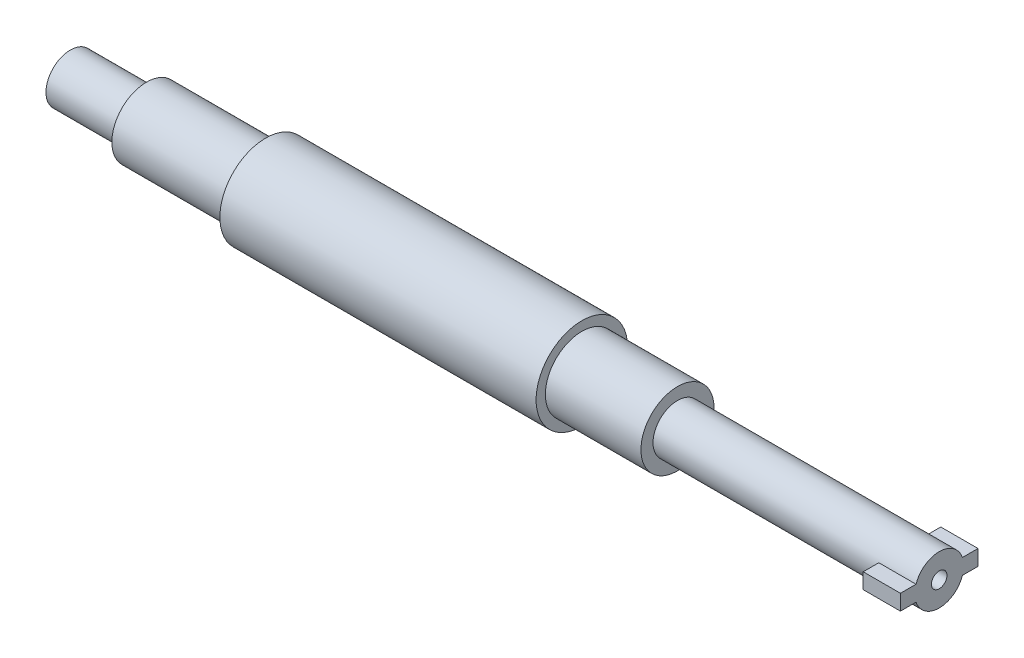
ISO-10303-21;
HEADER;
FILE_DESCRIPTION(('STEP AP214'),'2;1');
FILE_NAME('part.step','',(''),(''),'','','');
FILE_SCHEMA(('AUTOMOTIVE_DESIGN { 1 0 10303 214 1 1 1 1 }'));
ENDSEC;
DATA;
#1=APPLICATION_CONTEXT('core data for automotive mechanical design processes');
#2=APPLICATION_PROTOCOL_DEFINITION('international standard','automotive_design',2000,#1);
#3=PRODUCT_CONTEXT('',#1,'mechanical');
#4=PRODUCT('Part','Part','',(#3));
#5=PRODUCT_RELATED_PRODUCT_CATEGORY('part','',(#4));
#6=PRODUCT_DEFINITION_FORMATION('','',#4);
#7=PRODUCT_DEFINITION_CONTEXT('part definition',#1,'design');
#8=PRODUCT_DEFINITION('design','',#6,#7);
#9=PRODUCT_DEFINITION_SHAPE('','',#8);
#10=(LENGTH_UNIT() NAMED_UNIT(*) SI_UNIT(.MILLI.,.METRE.));
#11=(NAMED_UNIT(*) PLANE_ANGLE_UNIT() SI_UNIT($,.RADIAN.));
#12=(NAMED_UNIT(*) SI_UNIT($,.STERADIAN.) SOLID_ANGLE_UNIT());
#13=UNCERTAINTY_MEASURE_WITH_UNIT(LENGTH_MEASURE(1.E-05),#10,'distance_accuracy_value','');
#14=(GEOMETRIC_REPRESENTATION_CONTEXT(3) GLOBAL_UNCERTAINTY_ASSIGNED_CONTEXT((#13)) GLOBAL_UNIT_ASSIGNED_CONTEXT((#10,
#11,#12)) REPRESENTATION_CONTEXT('',''));
#15=CARTESIAN_POINT('',(0.,0.,0.));
#16=DIRECTION('',(0.,0.,1.));
#17=DIRECTION('',(1.,0.,0.));
#18=AXIS2_PLACEMENT_3D('',#15,#16,#17);
#19=CARTESIAN_POINT('',(177.8,0.,0.));
#20=DIRECTION('',(-1.,0.,0.));
#21=DIRECTION('',(0.,0.,1.));
#22=AXIS2_PLACEMENT_3D('',#19,#20,#21);
#23=CYLINDRICAL_SURFACE('',#22,5.);
#24=CARTESIAN_POINT('',(124.236525444796,0.,0.));
#25=DIRECTION('',(-1.,0.,0.));
#26=DIRECTION('',(0.,0.,1.));
#27=AXIS2_PLACEMENT_3D('',#24,#25,#26);
#28=CIRCLE('',#27,5.);
#29=CARTESIAN_POINT('',(124.236525444796,0.,5.));
#30=VERTEX_POINT('',#29);
#31=EDGE_CURVE('E43',#30,#30,#28,.T.);
#32=ORIENTED_EDGE('',*,*,#31,.F.);
#33=EDGE_LOOP('',(#32));
#34=FACE_BOUND('',#33,.T.);
#35=CARTESIAN_POINT('',(170.18,0.,0.));
#36=DIRECTION('',(1.,0.,0.));
#37=DIRECTION('',(0.,0.,-1.));
#38=AXIS2_PLACEMENT_3D('',#35,#36,#37);
#39=CIRCLE('',#38,5.);
#40=CARTESIAN_POINT('',(170.18,1.5875,4.74129135890213));
#41=VERTEX_POINT('',#40);
#42=CARTESIAN_POINT('',(170.18,-1.5875,4.74129135890213));
#43=VERTEX_POINT('',#42);
#44=EDGE_CURVE('E126',#41,#43,#39,.T.);
#45=ORIENTED_EDGE('',*,*,#44,.F.);
#46=DIRECTION('',(-1.,0.,0.));
#47=VECTOR('',#46,1.);
#48=CARTESIAN_POINT('',(177.8,1.5875,4.74129135890213));
#49=LINE('',#48,#47);
#50=CARTESIAN_POINT('',(177.8,1.5875,4.74129135890213));
#51=VERTEX_POINT('',#50);
#52=EDGE_CURVE('E176',#41,#51,#49,.F.);
#53=ORIENTED_EDGE('',*,*,#52,.T.);
#54=CARTESIAN_POINT('',(177.8,0.,0.));
#55=DIRECTION('',(1.,0.,0.));
#56=DIRECTION('',(0.,0.,-1.));
#57=AXIS2_PLACEMENT_3D('',#54,#55,#56);
#58=CIRCLE('',#57,5.);
#59=CARTESIAN_POINT('',(177.8,1.5875,-4.74129135890213));
#60=VERTEX_POINT('',#59);
#61=EDGE_CURVE('E185',#60,#51,#58,.T.);
#62=ORIENTED_EDGE('',*,*,#61,.F.);
#63=DIRECTION('',(-1.,0.,0.));
#64=VECTOR('',#63,1.);
#65=CARTESIAN_POINT('',(177.8,1.5875,-4.74129135890213));
#66=LINE('',#65,#64);
#67=CARTESIAN_POINT('',(170.18,1.5875,-4.74129135890213));
#68=VERTEX_POINT('',#67);
#69=EDGE_CURVE('E180',#60,#68,#66,.T.);
#70=ORIENTED_EDGE('',*,*,#69,.T.);
#71=CARTESIAN_POINT('',(170.18,-1.5875,-4.74129135890213));
#72=VERTEX_POINT('',#71);
#73=EDGE_CURVE('E188',#72,#68,#39,.T.);
#74=ORIENTED_EDGE('',*,*,#73,.F.);
#75=DIRECTION('',(-1.,0.,0.));
#76=VECTOR('',#75,1.);
#77=CARTESIAN_POINT('',(177.8,-1.5875,-4.74129135890213));
#78=LINE('',#77,#76);
#79=CARTESIAN_POINT('',(177.8,-1.5875,-4.74129135890213));
#80=VERTEX_POINT('',#79);
#81=EDGE_CURVE('E163',#72,#80,#78,.F.);
#82=ORIENTED_EDGE('',*,*,#81,.T.);
#83=CARTESIAN_POINT('',(177.8,-1.5875,4.74129135890213));
#84=VERTEX_POINT('',#83);
#85=EDGE_CURVE('E189',#84,#80,#58,.T.);
#86=ORIENTED_EDGE('',*,*,#85,.F.);
#87=DIRECTION('',(-1.,0.,0.));
#88=VECTOR('',#87,1.);
#89=CARTESIAN_POINT('',(177.8,-1.5875,4.74129135890213));
#90=LINE('',#89,#88);
#91=EDGE_CURVE('E173',#84,#43,#90,.T.);
#92=ORIENTED_EDGE('',*,*,#91,.T.);
#93=EDGE_LOOP('',(#45,#53,#62,#70,#74,#82,#86,#92));
#94=FACE_BOUND('',#93,.T.);
#95=ADVANCED_FACE('F39',(#34,#94),#23,.T.);
#96=CARTESIAN_POINT('',(127.,0.,0.));
#97=DIRECTION('',(1.,0.,0.));
#98=DIRECTION('',(0.,0.,-1.));
#99=AXIS2_PLACEMENT_3D('',#96,#97,#98);
#100=CYLINDRICAL_SURFACE('',#99,1.5875);
#101=CARTESIAN_POINT('',(177.8,0.,0.));
#102=DIRECTION('',(1.,0.,0.));
#103=DIRECTION('',(0.,0.,-1.));
#104=AXIS2_PLACEMENT_3D('',#101,#102,#103);
#105=CIRCLE('',#104,1.5875);
#106=CARTESIAN_POINT('',(177.8,0.,-1.5875));
#107=VERTEX_POINT('',#106);
#108=EDGE_CURVE('E142',#107,#107,#105,.T.);
#109=ORIENTED_EDGE('',*,*,#108,.T.);
#110=EDGE_LOOP('',(#109));
#111=FACE_BOUND('',#110,.T.);
#112=CARTESIAN_POINT('',(144.055202202781,0.,0.));
#113=DIRECTION('',(-1.,0.,0.));
#114=DIRECTION('',(0.,0.,1.));
#115=AXIS2_PLACEMENT_3D('',#112,#113,#114);
#116=CIRCLE('',#115,1.5875);
#117=CARTESIAN_POINT('',(144.055202202781,0.,1.5875));
#118=VERTEX_POINT('',#117);
#119=EDGE_CURVE('E198',#118,#118,#116,.F.);
#120=ORIENTED_EDGE('',*,*,#119,.F.);
#121=EDGE_LOOP('',(#120));
#122=FACE_BOUND('',#121,.T.);
#123=ADVANCED_FACE('F212',(#111,#122),#100,.F.);
#124=CARTESIAN_POINT('',(177.8,0.,0.));
#125=DIRECTION('',(1.,0.,0.));
#126=DIRECTION('',(0.,0.,-1.));
#127=AXIS2_PLACEMENT_3D('',#124,#125,#126);
#128=PLANE('',#127);
#129=ORIENTED_EDGE('',*,*,#108,.F.);
#130=EDGE_LOOP('',(#129));
#131=FACE_BOUND('',#130,.T.);
#132=ORIENTED_EDGE('',*,*,#85,.T.);
#133=DIRECTION('',(0.,0.,-1.));
#134=VECTOR('',#133,1.);
#135=CARTESIAN_POINT('',(177.8,-1.5875,-7.9375));
#136=LINE('',#135,#134);
#137=CARTESIAN_POINT('',(177.8,-1.5875,-7.9375));
#138=VERTEX_POINT('',#137);
#139=EDGE_CURVE('E155',#80,#138,#136,.T.);
#140=ORIENTED_EDGE('',*,*,#139,.T.);
#141=DIRECTION('',(0.,1.,0.));
#142=VECTOR('',#141,1.);
#143=CARTESIAN_POINT('',(177.8,-1.5875,-7.9375));
#144=LINE('',#143,#142);
#145=CARTESIAN_POINT('',(177.8,1.5875,-7.9375));
#146=VERTEX_POINT('',#145);
#147=EDGE_CURVE('E158',#138,#146,#144,.T.);
#148=ORIENTED_EDGE('',*,*,#147,.T.);
#149=DIRECTION('',(0.,0.,1.));
#150=VECTOR('',#149,1.);
#151=CARTESIAN_POINT('',(177.8,1.5875,-7.9375));
#152=LINE('',#151,#150);
#153=EDGE_CURVE('E63',#146,#60,#152,.T.);
#154=ORIENTED_EDGE('',*,*,#153,.T.);
#155=ORIENTED_EDGE('',*,*,#61,.T.);
#156=CARTESIAN_POINT('',(177.8,1.5875,7.9375));
#157=VERTEX_POINT('',#156);
#158=EDGE_CURVE('E139',#51,#157,#152,.T.);
#159=ORIENTED_EDGE('',*,*,#158,.T.);
#160=DIRECTION('',(0.,-1.,0.));
#161=VECTOR('',#160,1.);
#162=CARTESIAN_POINT('',(177.8,-1.5875,7.9375));
#163=LINE('',#162,#161);
#164=CARTESIAN_POINT('',(177.8,-1.5875,7.9375));
#165=VERTEX_POINT('',#164);
#166=EDGE_CURVE('E152',#157,#165,#163,.T.);
#167=ORIENTED_EDGE('',*,*,#166,.T.);
#168=EDGE_CURVE('E56',#165,#84,#136,.T.);
#169=ORIENTED_EDGE('',*,*,#168,.T.);
#170=EDGE_LOOP('',(#132,#140,#148,#154,#155,#159,#167,#169));
#171=FACE_BOUND('',#170,.T.);
#172=ADVANCED_FACE('F314',(#131,#171),#128,.T.);
#173=CARTESIAN_POINT('',(170.18,-1.5875,-7.9375));
#174=DIRECTION('',(0.,0.,-1.));
#175=DIRECTION('',(-1.,0.,0.));
#176=AXIS2_PLACEMENT_3D('',#173,#174,#175);
#177=PLANE('',#176);
#178=ORIENTED_EDGE('',*,*,#147,.F.);
#179=DIRECTION('',(1.,0.,0.));
#180=VECTOR('',#179,1.);
#181=CARTESIAN_POINT('',(170.18,-1.5875,-7.9375));
#182=LINE('',#181,#180);
#183=CARTESIAN_POINT('',(170.18,-1.5875,-7.9375));
#184=VERTEX_POINT('',#183);
#185=EDGE_CURVE('E117',#184,#138,#182,.T.);
#186=ORIENTED_EDGE('',*,*,#185,.F.);
#187=DIRECTION('',(0.,1.,0.));
#188=VECTOR('',#187,1.);
#189=CARTESIAN_POINT('',(170.18,-1.5875,-7.9375));
#190=LINE('',#189,#188);
#191=CARTESIAN_POINT('',(170.18,1.5875,-7.9375));
#192=VERTEX_POINT('',#191);
#193=EDGE_CURVE('E128',#184,#192,#190,.T.);
#194=ORIENTED_EDGE('',*,*,#193,.T.);
#195=DIRECTION('',(1.,0.,0.));
#196=VECTOR('',#195,1.);
#197=CARTESIAN_POINT('',(170.18,1.5875,-7.9375));
#198=LINE('',#197,#196);
#199=EDGE_CURVE('E164',#192,#146,#198,.T.);
#200=ORIENTED_EDGE('',*,*,#199,.T.);
#201=EDGE_LOOP('',(#178,#186,#194,#200));
#202=FACE_BOUND('',#201,.T.);
#203=ADVANCED_FACE('F320',(#202),#177,.T.);
#204=CARTESIAN_POINT('',(170.18,0.,0.));
#205=DIRECTION('',(1.,0.,0.));
#206=DIRECTION('',(0.,0.,-1.));
#207=AXIS2_PLACEMENT_3D('',#204,#205,#206);
#208=PLANE('',#207);
#209=DIRECTION('',(0.,0.,-1.));
#210=VECTOR('',#209,1.);
#211=CARTESIAN_POINT('',(170.18,-1.5875,-7.9375));
#212=LINE('',#211,#210);
#213=EDGE_CURVE('E129',#72,#184,#212,.T.);
#214=ORIENTED_EDGE('',*,*,#213,.F.);
#215=ORIENTED_EDGE('',*,*,#73,.T.);
#216=DIRECTION('',(0.,0.,1.));
#217=VECTOR('',#216,1.);
#218=CARTESIAN_POINT('',(170.18,1.5875,-7.9375));
#219=LINE('',#218,#217);
#220=EDGE_CURVE('E118',#192,#68,#219,.T.);
#221=ORIENTED_EDGE('',*,*,#220,.F.);
#222=ORIENTED_EDGE('',*,*,#193,.F.);
#223=EDGE_LOOP('',(#214,#215,#221,#222));
#224=FACE_BOUND('',#223,.T.);
#225=ADVANCED_FACE('F316',(#224),#208,.F.);
#226=CARTESIAN_POINT('',(170.18,-1.5875,-7.9375));
#227=DIRECTION('',(0.,-1.,0.));
#228=DIRECTION('',(0.,0.,-1.));
#229=AXIS2_PLACEMENT_3D('',#226,#227,#228);
#230=PLANE('',#229);
#231=ORIENTED_EDGE('',*,*,#81,.F.);
#232=ORIENTED_EDGE('',*,*,#213,.T.);
#233=ORIENTED_EDGE('',*,*,#185,.T.);
#234=ORIENTED_EDGE('',*,*,#139,.F.);
#235=EDGE_LOOP('',(#231,#232,#233,#234));
#236=FACE_BOUND('',#235,.T.);
#237=ADVANCED_FACE('F319',(#236),#230,.T.);
#238=CARTESIAN_POINT('',(170.18,1.5875,-7.9375));
#239=DIRECTION('',(0.,1.,0.));
#240=DIRECTION('',(0.,0.,1.));
#241=AXIS2_PLACEMENT_3D('',#238,#239,#240);
#242=PLANE('',#241);
#243=ORIENTED_EDGE('',*,*,#69,.F.);
#244=ORIENTED_EDGE('',*,*,#153,.F.);
#245=ORIENTED_EDGE('',*,*,#199,.F.);
#246=ORIENTED_EDGE('',*,*,#220,.T.);
#247=EDGE_LOOP('',(#243,#244,#245,#246));
#248=FACE_BOUND('',#247,.T.);
#249=ADVANCED_FACE('F322',(#248),#242,.T.);
#250=CARTESIAN_POINT('',(170.18,1.5875,7.9375));
#251=VERTEX_POINT('',#250);
#252=EDGE_CURVE('E148',#41,#251,#219,.T.);
#253=ORIENTED_EDGE('',*,*,#252,.F.);
#254=ORIENTED_EDGE('',*,*,#44,.T.);
#255=CARTESIAN_POINT('',(170.18,-1.5875,7.9375));
#256=VERTEX_POINT('',#255);
#257=EDGE_CURVE('E111',#256,#43,#212,.T.);
#258=ORIENTED_EDGE('',*,*,#257,.F.);
#259=DIRECTION('',(0.,-1.,0.));
#260=VECTOR('',#259,1.);
#261=CARTESIAN_POINT('',(170.18,-1.5875,7.9375));
#262=LINE('',#261,#260);
#263=EDGE_CURVE('E124',#251,#256,#262,.T.);
#264=ORIENTED_EDGE('',*,*,#263,.F.);
#265=EDGE_LOOP('',(#253,#254,#258,#264));
#266=FACE_BOUND('',#265,.T.);
#267=ADVANCED_FACE('F123',(#266),#208,.F.);
#268=ORIENTED_EDGE('',*,*,#52,.F.);
#269=ORIENTED_EDGE('',*,*,#252,.T.);
#270=DIRECTION('',(1.,0.,0.));
#271=VECTOR('',#270,1.);
#272=CARTESIAN_POINT('',(170.18,1.5875,7.9375));
#273=LINE('',#272,#271);
#274=EDGE_CURVE('E134',#251,#157,#273,.T.);
#275=ORIENTED_EDGE('',*,*,#274,.T.);
#276=ORIENTED_EDGE('',*,*,#158,.F.);
#277=EDGE_LOOP('',(#268,#269,#275,#276));
#278=FACE_BOUND('',#277,.T.);
#279=ADVANCED_FACE('F219',(#278),#242,.T.);
#280=ORIENTED_EDGE('',*,*,#91,.F.);
#281=ORIENTED_EDGE('',*,*,#168,.F.);
#282=DIRECTION('',(1.,0.,0.));
#283=VECTOR('',#282,1.);
#284=CARTESIAN_POINT('',(170.18,-1.5875,7.9375));
#285=LINE('',#284,#283);
#286=EDGE_CURVE('E108',#256,#165,#285,.T.);
#287=ORIENTED_EDGE('',*,*,#286,.F.);
#288=ORIENTED_EDGE('',*,*,#257,.T.);
#289=EDGE_LOOP('',(#280,#281,#287,#288));
#290=FACE_BOUND('',#289,.T.);
#291=ADVANCED_FACE('F110',(#290),#230,.T.);
#292=CARTESIAN_POINT('',(170.18,-1.5875,7.9375));
#293=DIRECTION('',(0.,0.,1.));
#294=DIRECTION('',(1.,0.,0.));
#295=AXIS2_PLACEMENT_3D('',#292,#293,#294);
#296=PLANE('',#295);
#297=ORIENTED_EDGE('',*,*,#166,.F.);
#298=ORIENTED_EDGE('',*,*,#274,.F.);
#299=ORIENTED_EDGE('',*,*,#263,.T.);
#300=ORIENTED_EDGE('',*,*,#286,.T.);
#301=EDGE_LOOP('',(#297,#298,#299,#300));
#302=FACE_BOUND('',#301,.T.);
#303=ADVANCED_FACE('F132',(#302),#296,.T.);
#304=CARTESIAN_POINT('',(144.055202202781,0.,5.));
#305=DIRECTION('',(-1.,0.,0.));
#306=DIRECTION('',(0.,0.,1.));
#307=AXIS2_PLACEMENT_3D('',#304,#305,#306);
#308=PLANE('',#307);
#309=ORIENTED_EDGE('',*,*,#119,.T.);
#310=EDGE_LOOP('',(#309));
#311=FACE_BOUND('',#310,.T.);
#312=ADVANCED_FACE('F286',(#311),#308,.F.);
#313=CARTESIAN_POINT('',(15.5784759151439,0.,0.));
#314=DIRECTION('',(1.,0.,0.));
#315=DIRECTION('',(0.,0.,-1.));
#316=AXIS2_PLACEMENT_3D('',#313,#314,#315);
#317=PLANE('',#316);
#318=CARTESIAN_POINT('',(15.5784759151439,0.,0.));
#319=DIRECTION('',(1.,0.,0.));
#320=DIRECTION('',(0.,0.,-1.));
#321=AXIS2_PLACEMENT_3D('',#318,#319,#320);
#322=CIRCLE('',#321,7.09672105761783);
#323=CARTESIAN_POINT('',(15.5784759151439,0.,-7.09672105761783));
#324=VERTEX_POINT('',#323);
#325=EDGE_CURVE('E228',#324,#324,#322,.T.);
#326=ORIENTED_EDGE('',*,*,#325,.F.);
#327=EDGE_LOOP('',(#326));
#328=FACE_BOUND('',#327,.T.);
#329=CARTESIAN_POINT('',(15.5784759151439,0.,0.));
#330=DIRECTION('',(1.,0.,0.));
#331=DIRECTION('',(0.,0.,-1.));
#332=AXIS2_PLACEMENT_3D('',#329,#330,#331);
#333=CIRCLE('',#332,5.);
#334=CARTESIAN_POINT('',(15.5784759151439,0.,-5.));
#335=VERTEX_POINT('',#334);
#336=EDGE_CURVE('E11',#335,#335,#333,.T.);
#337=ORIENTED_EDGE('',*,*,#336,.T.);
#338=EDGE_LOOP('',(#337));
#339=FACE_BOUND('',#338,.T.);
#340=ADVANCED_FACE('F280',(#328,#339),#317,.F.);
#341=CARTESIAN_POINT('',(144.055202202781,0.,0.));
#342=DIRECTION('',(1.,0.,0.));
#343=DIRECTION('',(0.,0.,-1.));
#344=AXIS2_PLACEMENT_3D('',#341,#342,#343);
#345=CYLINDRICAL_SURFACE('',#344,7.09672105761783);
#346=CARTESIAN_POINT('',(39.9579102748897,0.,0.));
#347=DIRECTION('',(1.,0.,0.));
#348=DIRECTION('',(0.,0.,-1.));
#349=AXIS2_PLACEMENT_3D('',#346,#347,#348);
#350=CIRCLE('',#349,7.09672105761783);
#351=CARTESIAN_POINT('',(39.9579102748897,0.,-7.09672105761783));
#352=VERTEX_POINT('',#351);
#353=EDGE_CURVE('E231',#352,#352,#350,.T.);
#354=ORIENTED_EDGE('',*,*,#353,.F.);
#355=EDGE_LOOP('',(#354));
#356=FACE_BOUND('',#355,.T.);
#357=ORIENTED_EDGE('',*,*,#325,.T.);
#358=EDGE_LOOP('',(#357));
#359=FACE_BOUND('',#358,.T.);
#360=ADVANCED_FACE('F274',(#356,#359),#345,.T.);
#361=CARTESIAN_POINT('',(39.9579102748897,0.,7.09672105761783));
#362=DIRECTION('',(1.,0.,0.));
#363=DIRECTION('',(0.,0.,-1.));
#364=AXIS2_PLACEMENT_3D('',#361,#362,#363);
#365=PLANE('',#364);
#366=CARTESIAN_POINT('',(39.9579102748897,0.,0.));
#367=DIRECTION('',(1.,0.,0.));
#368=DIRECTION('',(0.,0.,-1.));
#369=AXIS2_PLACEMENT_3D('',#366,#367,#368);
#370=CIRCLE('',#369,9.36767179605624);
#371=CARTESIAN_POINT('',(39.9579102748897,0.,-9.36767179605624));
#372=VERTEX_POINT('',#371);
#373=EDGE_CURVE('E235',#372,#372,#370,.T.);
#374=ORIENTED_EDGE('',*,*,#373,.F.);
#375=EDGE_LOOP('',(#374));
#376=FACE_BOUND('',#375,.T.);
#377=ORIENTED_EDGE('',*,*,#353,.T.);
#378=EDGE_LOOP('',(#377));
#379=FACE_BOUND('',#378,.T.);
#380=ADVANCED_FACE('F268',(#376,#379),#365,.F.);
#381=CARTESIAN_POINT('',(144.055202202781,0.,0.));
#382=DIRECTION('',(1.,0.,0.));
#383=DIRECTION('',(0.,0.,-1.));
#384=AXIS2_PLACEMENT_3D('',#381,#382,#383);
#385=CYLINDRICAL_SURFACE('',#384,9.36767179605624);
#386=CARTESIAN_POINT('',(104.670198297704,0.,0.));
#387=DIRECTION('',(1.,0.,0.));
#388=DIRECTION('',(0.,0.,-1.));
#389=AXIS2_PLACEMENT_3D('',#386,#387,#388);
#390=CIRCLE('',#389,9.36767179605624);
#391=CARTESIAN_POINT('',(104.670198297704,0.,-9.36767179605624));
#392=VERTEX_POINT('',#391);
#393=EDGE_CURVE('E239',#392,#392,#390,.T.);
#394=ORIENTED_EDGE('',*,*,#393,.F.);
#395=EDGE_LOOP('',(#394));
#396=FACE_BOUND('',#395,.T.);
#397=ORIENTED_EDGE('',*,*,#373,.T.);
#398=EDGE_LOOP('',(#397));
#399=FACE_BOUND('',#398,.T.);
#400=ADVANCED_FACE('F262',(#396,#399),#385,.T.);
#401=CARTESIAN_POINT('',(104.670198297704,0.,9.36767179605624));
#402=DIRECTION('',(-1.,0.,0.));
#403=DIRECTION('',(0.,0.,1.));
#404=AXIS2_PLACEMENT_3D('',#401,#402,#403);
#405=PLANE('',#404);
#406=CARTESIAN_POINT('',(104.670198297704,0.,0.));
#407=DIRECTION('',(1.,0.,0.));
#408=DIRECTION('',(0.,0.,-1.));
#409=AXIS2_PLACEMENT_3D('',#406,#407,#408);
#410=CIRCLE('',#409,7.47521284735697);
#411=CARTESIAN_POINT('',(104.670198297704,0.,-7.47521284735697));
#412=VERTEX_POINT('',#411);
#413=EDGE_CURVE('E243',#412,#412,#410,.T.);
#414=ORIENTED_EDGE('',*,*,#413,.F.);
#415=EDGE_LOOP('',(#414));
#416=FACE_BOUND('',#415,.T.);
#417=ORIENTED_EDGE('',*,*,#393,.T.);
#418=EDGE_LOOP('',(#417));
#419=FACE_BOUND('',#418,.T.);
#420=ADVANCED_FACE('F256',(#416,#419),#405,.F.);
#421=CARTESIAN_POINT('',(144.055202202781,0.,0.));
#422=DIRECTION('',(1.,0.,0.));
#423=DIRECTION('',(0.,0.,-1.));
#424=AXIS2_PLACEMENT_3D('',#421,#422,#423);
#425=CYLINDRICAL_SURFACE('',#424,7.47521284735697);
#426=CARTESIAN_POINT('',(124.236525444796,0.,0.));
#427=DIRECTION('',(1.,0.,0.));
#428=DIRECTION('',(0.,0.,-1.));
#429=AXIS2_PLACEMENT_3D('',#426,#427,#428);
#430=CIRCLE('',#429,7.47521284735697);
#431=CARTESIAN_POINT('',(124.236525444796,0.,-7.47521284735697));
#432=VERTEX_POINT('',#431);
#433=EDGE_CURVE('E247',#432,#432,#430,.T.);
#434=ORIENTED_EDGE('',*,*,#433,.F.);
#435=EDGE_LOOP('',(#434));
#436=FACE_BOUND('',#435,.T.);
#437=ORIENTED_EDGE('',*,*,#413,.T.);
#438=EDGE_LOOP('',(#437));
#439=FACE_BOUND('',#438,.T.);
#440=ADVANCED_FACE('F253',(#436,#439),#425,.T.);
#441=CARTESIAN_POINT('',(124.236525444796,0.,7.47521284735697));
#442=DIRECTION('',(-1.,0.,0.));
#443=DIRECTION('',(0.,0.,1.));
#444=AXIS2_PLACEMENT_3D('',#441,#442,#443);
#445=PLANE('',#444);
#446=ORIENTED_EDGE('',*,*,#31,.T.);
#447=EDGE_LOOP('',(#446));
#448=FACE_BOUND('',#447,.T.);
#449=ORIENTED_EDGE('',*,*,#433,.T.);
#450=EDGE_LOOP('',(#449));
#451=FACE_BOUND('',#450,.T.);
#452=ADVANCED_FACE('F207',(#448,#451),#445,.F.);
#453=CARTESIAN_POINT('',(0.,0.,0.));
#454=DIRECTION('',(1.,0.,0.));
#455=DIRECTION('',(0.,0.,-1.));
#456=AXIS2_PLACEMENT_3D('',#453,#454,#455);
#457=CIRCLE('',#456,5.);
#458=CARTESIAN_POINT('',(0.,0.,-5.));
#459=VERTEX_POINT('',#458);
#460=EDGE_CURVE('E184',#459,#459,#457,.T.);
#461=ORIENTED_EDGE('',*,*,#460,.T.);
#462=EDGE_LOOP('',(#461));
#463=FACE_BOUND('',#462,.T.);
#464=ORIENTED_EDGE('',*,*,#336,.F.);
#465=EDGE_LOOP('',(#464));
#466=FACE_BOUND('',#465,.T.);
#467=ADVANCED_FACE('F41',(#463,#466),#23,.T.);
#468=CARTESIAN_POINT('',(0.,0.,0.));
#469=DIRECTION('',(1.,0.,0.));
#470=DIRECTION('',(0.,0.,-1.));
#471=AXIS2_PLACEMENT_3D('',#468,#469,#470);
#472=PLANE('',#471);
#473=CARTESIAN_POINT('',(0.,0.,0.));
#474=DIRECTION('',(-1.,0.,0.));
#475=DIRECTION('',(0.,0.,1.));
#476=AXIS2_PLACEMENT_3D('',#473,#474,#475);
#477=CIRCLE('',#476,4.);
#478=CARTESIAN_POINT('',(0.,0.,4.));
#479=VERTEX_POINT('',#478);
#480=EDGE_CURVE('E225',#479,#479,#477,.T.);
#481=ORIENTED_EDGE('',*,*,#480,.F.);
#482=EDGE_LOOP('',(#481));
#483=FACE_BOUND('',#482,.T.);
#484=ORIENTED_EDGE('',*,*,#460,.F.);
#485=EDGE_LOOP('',(#484));
#486=FACE_BOUND('',#485,.T.);
#487=ADVANCED_FACE('F292',(#483,#486),#472,.F.);
#488=CARTESIAN_POINT('',(25.4,0.,0.));
#489=DIRECTION('',(-1.,0.,0.));
#490=DIRECTION('',(0.,0.,1.));
#491=AXIS2_PLACEMENT_3D('',#488,#489,#490);
#492=CYLINDRICAL_SURFACE('',#491,4.);
#493=ORIENTED_EDGE('',*,*,#480,.T.);
#494=EDGE_LOOP('',(#493));
#495=FACE_BOUND('',#494,.T.);
#496=CARTESIAN_POINT('',(15.5784759151439,0.,0.));
#497=DIRECTION('',(1.,0.,0.));
#498=DIRECTION('',(0.,0.,-1.));
#499=AXIS2_PLACEMENT_3D('',#496,#497,#498);
#500=CIRCLE('',#499,4.);
#501=CARTESIAN_POINT('',(15.5784759151439,0.,-4.));
#502=VERTEX_POINT('',#501);
#503=EDGE_CURVE('E195',#502,#502,#500,.F.);
#504=ORIENTED_EDGE('',*,*,#503,.F.);
#505=EDGE_LOOP('',(#504));
#506=FACE_BOUND('',#505,.T.);
#507=ADVANCED_FACE('F299',(#495,#506),#492,.F.);
#508=ORIENTED_EDGE('',*,*,#503,.T.);
#509=EDGE_LOOP('',(#508));
#510=FACE_BOUND('',#509,.T.);
#511=ADVANCED_FACE('F288',(#510),#317,.F.);
#512=CLOSED_SHELL('',(#95,#123,#172,#203,#225,#237,#249,#267,#279,#291,#303,#312,#340,#360,#380,
#400,#420,#440,#452,#467,#487,#507,#511));
#513=MANIFOLD_SOLID_BREP('B2',#512);
#514=ADVANCED_BREP_SHAPE_REPRESENTATION('',(#18,#513),#14);
#515=SHAPE_DEFINITION_REPRESENTATION(#9,#514);
ENDSEC;
END-ISO-10303-21;
